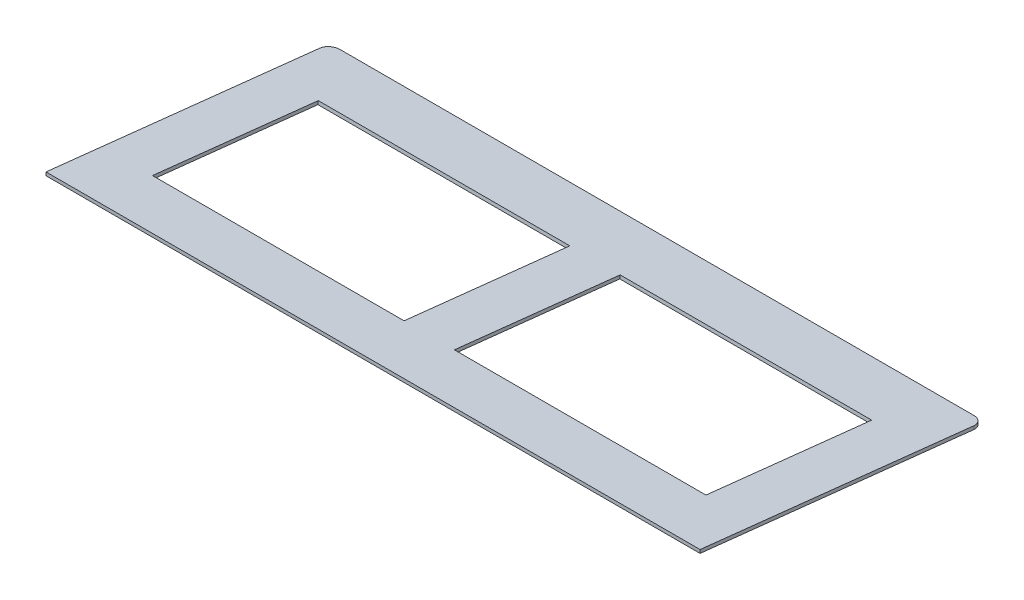
ISO-10303-21;
HEADER;
FILE_DESCRIPTION(('STEP AP214'),'2;1');
FILE_NAME('part.step','',(''),(''),'','','');
FILE_SCHEMA(('AUTOMOTIVE_DESIGN { 1 0 10303 214 1 1 1 1 }'));
ENDSEC;
DATA;
#1=APPLICATION_CONTEXT('core data for automotive mechanical design processes');
#2=APPLICATION_PROTOCOL_DEFINITION('international standard','automotive_design',2000,#1);
#3=PRODUCT_CONTEXT('',#1,'mechanical');
#4=PRODUCT('Part','Part','',(#3));
#5=PRODUCT_RELATED_PRODUCT_CATEGORY('part','',(#4));
#6=PRODUCT_DEFINITION_FORMATION('','',#4);
#7=PRODUCT_DEFINITION_CONTEXT('part definition',#1,'design');
#8=PRODUCT_DEFINITION('design','',#6,#7);
#9=PRODUCT_DEFINITION_SHAPE('','',#8);
#10=(LENGTH_UNIT() NAMED_UNIT(*) SI_UNIT(.MILLI.,.METRE.));
#11=(NAMED_UNIT(*) PLANE_ANGLE_UNIT() SI_UNIT($,.RADIAN.));
#12=(NAMED_UNIT(*) SI_UNIT($,.STERADIAN.) SOLID_ANGLE_UNIT());
#13=UNCERTAINTY_MEASURE_WITH_UNIT(LENGTH_MEASURE(1.E-05),#10,'distance_accuracy_value','');
#14=(GEOMETRIC_REPRESENTATION_CONTEXT(3) GLOBAL_UNCERTAINTY_ASSIGNED_CONTEXT((#13)) GLOBAL_UNIT_ASSIGNED_CONTEXT((#10,
#11,#12)) REPRESENTATION_CONTEXT('',''));
#15=CARTESIAN_POINT('',(0.,0.,0.));
#16=DIRECTION('',(0.,0.,1.));
#17=DIRECTION('',(1.,0.,0.));
#18=AXIS2_PLACEMENT_3D('',#15,#16,#17);
#19=CARTESIAN_POINT('',(530.482819889013,98.5307773034513,-137.4));
#20=DIRECTION('',(0.,0.,1.));
#21=DIRECTION('',(1.,0.,0.));
#22=AXIS2_PLACEMENT_3D('',#19,#20,#21);
#23=PLANE('',#22);
#24=DIRECTION('',(0.,-1.,0.));
#25=VECTOR('',#24,1.);
#26=CARTESIAN_POINT('',(354.,109.378207731382,-137.4));
#27=LINE('',#26,#25);
#28=CARTESIAN_POINT('',(354.,100.542515790759,-137.4));
#29=VERTEX_POINT('',#28);
#30=CARTESIAN_POINT('',(354.,98.5307773034513,-137.4));
#31=VERTEX_POINT('',#30);
#32=EDGE_CURVE('E231',#29,#31,#27,.T.);
#33=ORIENTED_EDGE('',*,*,#32,.T.);
#34=DIRECTION('',(-1.,0.,0.));
#35=VECTOR('',#34,1.);
#36=CARTESIAN_POINT('',(530.482819889013,98.5307773034513,-137.4));
#37=LINE('',#36,#35);
#38=CARTESIAN_POINT('',(-24.,98.5307773034513,-137.4));
#39=VERTEX_POINT('',#38);
#40=EDGE_CURVE('E270',#31,#39,#37,.T.);
#41=ORIENTED_EDGE('',*,*,#40,.T.);
#42=DIRECTION('',(0.,-1.,0.));
#43=VECTOR('',#42,1.);
#44=CARTESIAN_POINT('',(-24.,109.378207731382,-137.4));
#45=LINE('',#44,#43);
#46=CARTESIAN_POINT('',(-24.,100.542515790759,-137.4));
#47=VERTEX_POINT('',#46);
#48=EDGE_CURVE('E239',#47,#39,#45,.T.);
#49=ORIENTED_EDGE('',*,*,#48,.F.);
#50=DIRECTION('',(-1.,0.,0.));
#51=VECTOR('',#50,1.);
#52=CARTESIAN_POINT('',(530.482819889013,100.542515790759,-137.4));
#53=LINE('',#52,#51);
#54=EDGE_CURVE('E274',#29,#47,#53,.T.);
#55=ORIENTED_EDGE('',*,*,#54,.F.);
#56=EDGE_LOOP('',(#33,#41,#49,#55));
#57=FACE_BOUND('',#56,.T.);
#58=ADVANCED_FACE('F39',(#57),#23,.F.);
#59=CARTESIAN_POINT('',(360.,-349.404691512674,22.4));
#60=DIRECTION('',(1.,0.,0.));
#61=DIRECTION('',(0.,0.,-1.));
#62=AXIS2_PLACEMENT_3D('',#59,#60,#61);
#63=PLANE('',#62);
#64=DIRECTION('',(0.,-0.107870042588919,-0.994165003363056));
#65=VECTOR('',#64,1.);
#66=CARTESIAN_POINT('',(360.,113.764620707969,3.));
#67=LINE('',#66,#65);
#68=CARTESIAN_POINT('',(360.,116.896092356178,31.8606497870554));
#69=VERTEX_POINT('',#68);
#70=CARTESIAN_POINT('',(360.,99.1817962523623,-131.4));
#71=VERTEX_POINT('',#70);
#72=EDGE_CURVE('E49',#69,#71,#67,.T.);
#73=ORIENTED_EDGE('',*,*,#72,.T.);
#74=DIRECTION('',(0.,-1.,0.));
#75=VECTOR('',#74,1.);
#76=CARTESIAN_POINT('',(360.,109.378207731382,-131.4));
#77=LINE('',#76,#75);
#78=CARTESIAN_POINT('',(360.,101.19353473967,-131.4));
#79=VERTEX_POINT('',#78);
#80=EDGE_CURVE('E228',#79,#71,#77,.T.);
#81=ORIENTED_EDGE('',*,*,#80,.F.);
#82=DIRECTION('',(0.,0.107870042588919,0.994165003363056));
#83=VECTOR('',#82,1.);
#84=CARTESIAN_POINT('',(360.,100.542515790759,-137.4));
#85=LINE('',#84,#83);
#86=CARTESIAN_POINT('',(360.,118.907830843486,31.8606497870554));
#87=VERTEX_POINT('',#86);
#88=EDGE_CURVE('E11',#79,#87,#85,.T.);
#89=ORIENTED_EDGE('',*,*,#88,.T.);
#90=DIRECTION('',(0.,-1.,0.));
#91=VECTOR('',#90,1.);
#92=CARTESIAN_POINT('',(360.,118.907830843486,31.8606497870554));
#93=LINE('',#92,#91);
#94=EDGE_CURVE('E265',#87,#69,#93,.T.);
#95=ORIENTED_EDGE('',*,*,#94,.T.);
#96=EDGE_LOOP('',(#73,#81,#89,#95));
#97=FACE_BOUND('',#96,.T.);
#98=ADVANCED_FACE('F41',(#97),#63,.T.);
#99=CARTESIAN_POINT('',(530.482819889013,113.764620707969,3.));
#100=DIRECTION('',(0.,0.994165003363056,-0.107870042588919));
#101=DIRECTION('',(0.,0.107870042588919,0.994165003363056));
#102=AXIS2_PLACEMENT_3D('',#99,#100,#101);
#103=PLANE('',#102);
#104=DIRECTION('',(-1.,0.,0.));
#105=VECTOR('',#104,1.);
#106=CARTESIAN_POINT('',(150.,113.282734459728,-1.44121863777262));
#107=LINE('',#106,#105);
#108=CARTESIAN_POINT('',(150.,113.282734459728,-1.44121863777262));
#109=VERTEX_POINT('',#108);
#110=CARTESIAN_POINT('',(0.,113.282734459728,-1.4412186377726));
#111=VERTEX_POINT('',#110);
#112=EDGE_CURVE('E313',#109,#111,#107,.T.);
#113=ORIENTED_EDGE('',*,*,#112,.F.);
#114=DIRECTION('',(0.,0.107870042588919,0.994165003363056));
#115=VECTOR('',#114,1.);
#116=CARTESIAN_POINT('',(150.,102.558672334409,-100.277624028959));
#117=LINE('',#116,#115);
#118=CARTESIAN_POINT('',(150.,102.558672334409,-100.277624028959));
#119=VERTEX_POINT('',#118);
#120=EDGE_CURVE('E185',#119,#109,#117,.T.);
#121=ORIENTED_EDGE('',*,*,#120,.F.);
#122=DIRECTION('',(1.,0.,0.));
#123=VECTOR('',#122,1.);
#124=CARTESIAN_POINT('',(150.,102.558672334409,-100.277624028959));
#125=LINE('',#124,#123);
#126=CARTESIAN_POINT('',(0.,102.558672334409,-100.277624028959));
#127=VERTEX_POINT('',#126);
#128=EDGE_CURVE('E181',#127,#119,#125,.T.);
#129=ORIENTED_EDGE('',*,*,#128,.F.);
#130=DIRECTION('',(0.,-0.107870042588919,-0.994165003363056));
#131=VECTOR('',#130,1.);
#132=CARTESIAN_POINT('',(0.,102.558672334409,-100.277624028959));
#133=LINE('',#132,#131);
#134=EDGE_CURVE('E147',#111,#127,#133,.T.);
#135=ORIENTED_EDGE('',*,*,#134,.F.);
#136=EDGE_LOOP('',(#113,#121,#129,#135));
#137=FACE_BOUND('',#136,.T.);
#138=DIRECTION('',(0.,0.107870042588919,0.994165003363056));
#139=VECTOR('',#138,1.);
#140=CARTESIAN_POINT('',(330.,102.558672334409,-100.277624028959));
#141=LINE('',#140,#139);
#142=CARTESIAN_POINT('',(330.,102.558672334409,-100.277624028959));
#143=VERTEX_POINT('',#142);
#144=CARTESIAN_POINT('',(330.,113.282734459728,-1.44121863777262));
#145=VERTEX_POINT('',#144);
#146=EDGE_CURVE('E219',#143,#145,#141,.T.);
#147=ORIENTED_EDGE('',*,*,#146,.F.);
#148=DIRECTION('',(1.,0.,0.));
#149=VECTOR('',#148,1.);
#150=CARTESIAN_POINT('',(180.,102.558672334409,-100.277624028959));
#151=LINE('',#150,#149);
#152=CARTESIAN_POINT('',(180.,102.558672334409,-100.277624028959));
#153=VERTEX_POINT('',#152);
#154=EDGE_CURVE('E189',#153,#143,#151,.T.);
#155=ORIENTED_EDGE('',*,*,#154,.F.);
#156=DIRECTION('',(0.,-0.107870042588919,-0.994165003363056));
#157=VECTOR('',#156,1.);
#158=CARTESIAN_POINT('',(180.,102.558672334409,-100.277624028959));
#159=LINE('',#158,#157);
#160=CARTESIAN_POINT('',(180.,113.282734459728,-1.4412186377726));
#161=VERTEX_POINT('',#160);
#162=EDGE_CURVE('E186',#161,#153,#159,.T.);
#163=ORIENTED_EDGE('',*,*,#162,.F.);
#164=DIRECTION('',(-1.,0.,0.));
#165=VECTOR('',#164,1.);
#166=CARTESIAN_POINT('',(180.,113.282734459728,-1.44121863777262));
#167=LINE('',#166,#165);
#168=EDGE_CURVE('E203',#145,#161,#167,.T.);
#169=ORIENTED_EDGE('',*,*,#168,.F.);
#170=EDGE_LOOP('',(#147,#155,#163,#169));
#171=FACE_BOUND('',#170,.T.);
#172=ORIENTED_EDGE('',*,*,#40,.F.);
#173=CARTESIAN_POINT('',(354.,99.1817962523623,-131.4));
#174=DIRECTION('',(0.,0.994165003363056,-0.107870042588919));
#175=DIRECTION('',(0.,-0.107870042588919,-0.994165003363056));
#176=AXIS2_PLACEMENT_3D('',#173,#174,#175);
#177=ELLIPSE('',#176,6.03521546192356,6.00000000000001);
#178=EDGE_CURVE('E247',#31,#71,#177,.F.);
#179=ORIENTED_EDGE('',*,*,#178,.T.);
#180=ORIENTED_EDGE('',*,*,#72,.F.);
#181=DIRECTION('',(-1.,0.,0.));
#182=VECTOR('',#181,1.);
#183=CARTESIAN_POINT('',(530.482819889013,116.896092356178,31.8606497870554));
#184=LINE('',#183,#182);
#185=CARTESIAN_POINT('',(-30.,116.896092356178,31.8606497870554));
#186=VERTEX_POINT('',#185);
#187=EDGE_CURVE('E43',#69,#186,#184,.T.);
#188=ORIENTED_EDGE('',*,*,#187,.T.);
#189=DIRECTION('',(0.,-0.107870042588919,-0.994165003363056));
#190=VECTOR('',#189,1.);
#191=CARTESIAN_POINT('',(-30.,113.764620707969,3.));
#192=LINE('',#191,#190);
#193=CARTESIAN_POINT('',(-30.,99.1817962523623,-131.4));
#194=VERTEX_POINT('',#193);
#195=EDGE_CURVE('E251',#186,#194,#192,.T.);
#196=ORIENTED_EDGE('',*,*,#195,.T.);
#197=CARTESIAN_POINT('',(-24.,99.1817962523623,-131.4));
#198=DIRECTION('',(0.,0.994165003363056,-0.107870042588919));
#199=DIRECTION('',(0.,-0.107870042588919,-0.994165003363056));
#200=AXIS2_PLACEMENT_3D('',#197,#198,#199);
#201=ELLIPSE('',#200,6.03521546192356,6.);
#202=EDGE_CURVE('E227',#194,#39,#201,.F.);
#203=ORIENTED_EDGE('',*,*,#202,.T.);
#204=EDGE_LOOP('',(#172,#179,#180,#188,#196,#203));
#205=FACE_BOUND('',#204,.T.);
#206=ADVANCED_FACE('F293',(#137,#171,#205),#103,.F.);
#207=CARTESIAN_POINT('',(530.482819889013,100.542515790759,-137.4));
#208=DIRECTION('',(0.,-0.994165003363056,0.107870042588919));
#209=DIRECTION('',(0.,-0.107870042588919,-0.994165003363056));
#210=AXIS2_PLACEMENT_3D('',#207,#208,#209);
#211=PLANE('',#210);
#212=DIRECTION('',(-1.,0.,0.));
#213=VECTOR('',#212,1.);
#214=CARTESIAN_POINT('',(150.,104.547002341135,-100.493364114137));
#215=LINE('',#214,#213);
#216=CARTESIAN_POINT('',(150.,104.547002341135,-100.493364114137));
#217=VERTEX_POINT('',#216);
#218=CARTESIAN_POINT('',(0.,104.547002341135,-100.493364114137));
#219=VERTEX_POINT('',#218);
#220=EDGE_CURVE('E155',#217,#219,#215,.T.);
#221=ORIENTED_EDGE('',*,*,#220,.F.);
#222=DIRECTION('',(0.,-0.107870042588919,-0.994165003363056));
#223=VECTOR('',#222,1.);
#224=CARTESIAN_POINT('',(150.,104.547002341135,-100.493364114137));
#225=LINE('',#224,#223);
#226=CARTESIAN_POINT('',(150.,115.271064466454,-1.65695872295047));
#227=VERTEX_POINT('',#226);
#228=EDGE_CURVE('E161',#227,#217,#225,.T.);
#229=ORIENTED_EDGE('',*,*,#228,.F.);
#230=DIRECTION('',(1.,0.,0.));
#231=VECTOR('',#230,1.);
#232=CARTESIAN_POINT('',(150.,115.271064466454,-1.65695872295047));
#233=LINE('',#232,#231);
#234=CARTESIAN_POINT('',(0.,115.271064466454,-1.65695872295047));
#235=VERTEX_POINT('',#234);
#236=EDGE_CURVE('E166',#235,#227,#233,.T.);
#237=ORIENTED_EDGE('',*,*,#236,.F.);
#238=DIRECTION('',(0.,0.107870042588919,0.994165003363056));
#239=VECTOR('',#238,1.);
#240=CARTESIAN_POINT('',(0.,104.547002341135,-100.493364114137));
#241=LINE('',#240,#239);
#242=EDGE_CURVE('E144',#219,#235,#241,.T.);
#243=ORIENTED_EDGE('',*,*,#242,.F.);
#244=EDGE_LOOP('',(#221,#229,#237,#243));
#245=FACE_BOUND('',#244,.T.);
#246=DIRECTION('',(0.,0.107870042588919,0.994165003363056));
#247=VECTOR('',#246,1.);
#248=CARTESIAN_POINT('',(180.,104.547002341135,-100.493364114137));
#249=LINE('',#248,#247);
#250=CARTESIAN_POINT('',(180.,104.547002341135,-100.493364114137));
#251=VERTEX_POINT('',#250);
#252=CARTESIAN_POINT('',(180.,115.271064466454,-1.65695872295047));
#253=VERTEX_POINT('',#252);
#254=EDGE_CURVE('E211',#251,#253,#249,.T.);
#255=ORIENTED_EDGE('',*,*,#254,.F.);
#256=DIRECTION('',(-1.,0.,0.));
#257=VECTOR('',#256,1.);
#258=CARTESIAN_POINT('',(180.,104.547002341135,-100.493364114137));
#259=LINE('',#258,#257);
#260=CARTESIAN_POINT('',(330.,104.547002341135,-100.493364114137));
#261=VERTEX_POINT('',#260);
#262=EDGE_CURVE('E214',#261,#251,#259,.T.);
#263=ORIENTED_EDGE('',*,*,#262,.F.);
#264=DIRECTION('',(0.,-0.107870042588919,-0.994165003363056));
#265=VECTOR('',#264,1.);
#266=CARTESIAN_POINT('',(330.,104.547002341135,-100.493364114137));
#267=LINE('',#266,#265);
#268=CARTESIAN_POINT('',(330.,115.271064466454,-1.65695872295047));
#269=VERTEX_POINT('',#268);
#270=EDGE_CURVE('E194',#269,#261,#267,.T.);
#271=ORIENTED_EDGE('',*,*,#270,.F.);
#272=DIRECTION('',(1.,0.,0.));
#273=VECTOR('',#272,1.);
#274=CARTESIAN_POINT('',(180.,115.271064466454,-1.65695872295047));
#275=LINE('',#274,#273);
#276=EDGE_CURVE('E207',#253,#269,#275,.T.);
#277=ORIENTED_EDGE('',*,*,#276,.F.);
#278=EDGE_LOOP('',(#255,#263,#271,#277));
#279=FACE_BOUND('',#278,.T.);
#280=ORIENTED_EDGE('',*,*,#88,.F.);
#281=CARTESIAN_POINT('',(354.,101.19353473967,-131.4));
#282=DIRECTION('',(0.,-0.994165003363056,0.107870042588919));
#283=DIRECTION('',(0.,-0.107870042588919,-0.994165003363056));
#284=AXIS2_PLACEMENT_3D('',#281,#282,#283);
#285=ELLIPSE('',#284,6.03521546192356,6.00000000000001);
#286=EDGE_CURVE('E224',#29,#79,#285,.T.);
#287=ORIENTED_EDGE('',*,*,#286,.F.);
#288=ORIENTED_EDGE('',*,*,#54,.T.);
#289=CARTESIAN_POINT('',(-24.,101.19353473967,-131.4));
#290=DIRECTION('',(0.,-0.994165003363056,0.107870042588919));
#291=DIRECTION('',(0.,-0.107870042588919,-0.994165003363056));
#292=AXIS2_PLACEMENT_3D('',#289,#290,#291);
#293=ELLIPSE('',#292,6.03521546192356,6.);
#294=CARTESIAN_POINT('',(-30.,101.19353473967,-131.4));
#295=VERTEX_POINT('',#294);
#296=EDGE_CURVE('E184',#295,#47,#293,.T.);
#297=ORIENTED_EDGE('',*,*,#296,.F.);
#298=DIRECTION('',(0.,0.107870042588919,0.994165003363056));
#299=VECTOR('',#298,1.);
#300=CARTESIAN_POINT('',(-30.,100.542515790759,-137.4));
#301=LINE('',#300,#299);
#302=CARTESIAN_POINT('',(-30.,118.907830843486,31.8606497870554));
#303=VERTEX_POINT('',#302);
#304=EDGE_CURVE('E255',#295,#303,#301,.T.);
#305=ORIENTED_EDGE('',*,*,#304,.T.);
#306=DIRECTION('',(-1.,0.,0.));
#307=VECTOR('',#306,1.);
#308=CARTESIAN_POINT('',(530.482819889013,118.907830843486,31.8606497870554));
#309=LINE('',#308,#307);
#310=EDGE_CURVE('E269',#87,#303,#309,.T.);
#311=ORIENTED_EDGE('',*,*,#310,.F.);
#312=EDGE_LOOP('',(#280,#287,#288,#297,#305,#311));
#313=FACE_BOUND('',#312,.T.);
#314=ADVANCED_FACE('F163',(#245,#279,#313),#211,.F.);
#315=CARTESIAN_POINT('',(530.482819889013,118.907830843486,31.8606497870554));
#316=DIRECTION('',(0.,0.,-1.));
#317=DIRECTION('',(-1.,0.,0.));
#318=AXIS2_PLACEMENT_3D('',#315,#316,#317);
#319=PLANE('',#318);
#320=ORIENTED_EDGE('',*,*,#94,.F.);
#321=ORIENTED_EDGE('',*,*,#310,.T.);
#322=DIRECTION('',(0.,-1.,0.));
#323=VECTOR('',#322,1.);
#324=CARTESIAN_POINT('',(-30.,118.907830843486,31.8606497870554));
#325=LINE('',#324,#323);
#326=EDGE_CURVE('E256',#303,#186,#325,.T.);
#327=ORIENTED_EDGE('',*,*,#326,.T.);
#328=ORIENTED_EDGE('',*,*,#187,.F.);
#329=EDGE_LOOP('',(#320,#321,#327,#328));
#330=FACE_BOUND('',#329,.T.);
#331=ADVANCED_FACE('F284',(#330),#319,.F.);
#332=CARTESIAN_POINT('',(-30.,85.,-158.613203435596));
#333=DIRECTION('',(-1.,0.,0.));
#334=DIRECTION('',(0.,0.,1.));
#335=AXIS2_PLACEMENT_3D('',#332,#333,#334);
#336=PLANE('',#335);
#337=DIRECTION('',(0.,-1.,0.));
#338=VECTOR('',#337,1.);
#339=CARTESIAN_POINT('',(-30.,109.378207731382,-131.4));
#340=LINE('',#339,#338);
#341=EDGE_CURVE('E235',#295,#194,#340,.T.);
#342=ORIENTED_EDGE('',*,*,#341,.T.);
#343=ORIENTED_EDGE('',*,*,#195,.F.);
#344=ORIENTED_EDGE('',*,*,#326,.F.);
#345=ORIENTED_EDGE('',*,*,#304,.F.);
#346=EDGE_LOOP('',(#342,#343,#344,#345));
#347=FACE_BOUND('',#346,.T.);
#348=ADVANCED_FACE('F290',(#347),#336,.T.);
#349=CARTESIAN_POINT('',(-24.,109.378207731382,-131.4));
#350=DIRECTION('',(0.,-1.,0.));
#351=DIRECTION('',(0.,0.,-1.));
#352=AXIS2_PLACEMENT_3D('',#349,#350,#351);
#353=CYLINDRICAL_SURFACE('',#352,6.);
#354=ORIENTED_EDGE('',*,*,#341,.F.);
#355=ORIENTED_EDGE('',*,*,#296,.T.);
#356=ORIENTED_EDGE('',*,*,#48,.T.);
#357=ORIENTED_EDGE('',*,*,#202,.F.);
#358=EDGE_LOOP('',(#354,#355,#356,#357));
#359=FACE_BOUND('',#358,.T.);
#360=ADVANCED_FACE('F378',(#359),#353,.T.);
#361=CARTESIAN_POINT('',(354.,109.378207731382,-131.4));
#362=DIRECTION('',(0.,-1.,0.));
#363=DIRECTION('',(0.,0.,-1.));
#364=AXIS2_PLACEMENT_3D('',#361,#362,#363);
#365=CYLINDRICAL_SURFACE('',#364,6.00000000000001);
#366=ORIENTED_EDGE('',*,*,#32,.F.);
#367=ORIENTED_EDGE('',*,*,#286,.T.);
#368=ORIENTED_EDGE('',*,*,#80,.T.);
#369=ORIENTED_EDGE('',*,*,#178,.F.);
#370=EDGE_LOOP('',(#366,#367,#368,#369));
#371=FACE_BOUND('',#370,.T.);
#372=ADVANCED_FACE('F381',(#371),#365,.T.);
#373=CARTESIAN_POINT('',(180.,-76.34584477924,-80.8659189144995));
#374=DIRECTION('',(0.,-0.107870042588919,-0.994165003363056));
#375=DIRECTION('',(0.,0.994165003363056,-0.107870042588919));
#376=AXIS2_PLACEMENT_3D('',#373,#374,#375);
#377=PLANE('',#376);
#378=ORIENTED_EDGE('',*,*,#154,.T.);
#379=DIRECTION('',(0.,0.994165003363056,-0.107870042588919));
#380=VECTOR('',#379,1.);
#381=CARTESIAN_POINT('',(330.,-76.34584477924,-80.8659189144995));
#382=LINE('',#381,#380);
#383=EDGE_CURVE('E200',#143,#261,#382,.T.);
#384=ORIENTED_EDGE('',*,*,#383,.T.);
#385=ORIENTED_EDGE('',*,*,#262,.T.);
#386=DIRECTION('',(0.,0.994165003363056,-0.107870042588919));
#387=VECTOR('',#386,1.);
#388=CARTESIAN_POINT('',(180.,-76.34584477924,-80.8659189144995));
#389=LINE('',#388,#387);
#390=EDGE_CURVE('E190',#153,#251,#389,.T.);
#391=ORIENTED_EDGE('',*,*,#390,.F.);
#392=EDGE_LOOP('',(#378,#384,#385,#391));
#393=FACE_BOUND('',#392,.T.);
#394=ADVANCED_FACE('F353',(#393),#377,.F.);
#395=CARTESIAN_POINT('',(330.,-76.34584477924,-80.8659189144995));
#396=DIRECTION('',(1.,0.,0.));
#397=DIRECTION('',(0.,0.,-1.));
#398=AXIS2_PLACEMENT_3D('',#395,#396,#397);
#399=PLANE('',#398);
#400=ORIENTED_EDGE('',*,*,#146,.T.);
#401=DIRECTION('',(0.,0.994165003363056,-0.107870042588919));
#402=VECTOR('',#401,1.);
#403=CARTESIAN_POINT('',(330.,-65.6217826539214,17.970486476687));
#404=LINE('',#403,#402);
#405=EDGE_CURVE('E197',#145,#269,#404,.T.);
#406=ORIENTED_EDGE('',*,*,#405,.T.);
#407=ORIENTED_EDGE('',*,*,#270,.T.);
#408=ORIENTED_EDGE('',*,*,#383,.F.);
#409=EDGE_LOOP('',(#400,#406,#407,#408));
#410=FACE_BOUND('',#409,.T.);
#411=ADVANCED_FACE('F344',(#410),#399,.F.);
#412=CARTESIAN_POINT('',(180.,-65.6217826539214,17.970486476687));
#413=DIRECTION('',(0.,0.107870042588919,0.994165003363056));
#414=DIRECTION('',(0.,-0.994165003363056,0.107870042588919));
#415=AXIS2_PLACEMENT_3D('',#412,#413,#414);
#416=PLANE('',#415);
#417=ORIENTED_EDGE('',*,*,#168,.T.);
#418=DIRECTION('',(0.,0.994165003363056,-0.107870042588919));
#419=VECTOR('',#418,1.);
#420=CARTESIAN_POINT('',(180.,-65.6217826539214,17.970486476687));
#421=LINE('',#420,#419);
#422=EDGE_CURVE('E65',#161,#253,#421,.T.);
#423=ORIENTED_EDGE('',*,*,#422,.T.);
#424=ORIENTED_EDGE('',*,*,#276,.T.);
#425=ORIENTED_EDGE('',*,*,#405,.F.);
#426=EDGE_LOOP('',(#417,#423,#424,#425));
#427=FACE_BOUND('',#426,.T.);
#428=ADVANCED_FACE('F346',(#427),#416,.F.);
#429=CARTESIAN_POINT('',(180.,-76.34584477924,-80.8659189144995));
#430=DIRECTION('',(-1.,0.,0.));
#431=DIRECTION('',(0.,0.,1.));
#432=AXIS2_PLACEMENT_3D('',#429,#430,#431);
#433=PLANE('',#432);
#434=ORIENTED_EDGE('',*,*,#162,.T.);
#435=ORIENTED_EDGE('',*,*,#390,.T.);
#436=ORIENTED_EDGE('',*,*,#254,.T.);
#437=ORIENTED_EDGE('',*,*,#422,.F.);
#438=EDGE_LOOP('',(#434,#435,#436,#437));
#439=FACE_BOUND('',#438,.T.);
#440=ADVANCED_FACE('F354',(#439),#433,.F.);
#441=CARTESIAN_POINT('',(150.,-76.34584477924,-80.8659189144995));
#442=DIRECTION('',(1.,0.,0.));
#443=DIRECTION('',(0.,0.,-1.));
#444=AXIS2_PLACEMENT_3D('',#441,#442,#443);
#445=PLANE('',#444);
#446=ORIENTED_EDGE('',*,*,#120,.T.);
#447=DIRECTION('',(0.,0.994165003363056,-0.107870042588919));
#448=VECTOR('',#447,1.);
#449=CARTESIAN_POINT('',(150.,-65.6217826539214,17.970486476687));
#450=LINE('',#449,#448);
#451=EDGE_CURVE('E174',#109,#227,#450,.T.);
#452=ORIENTED_EDGE('',*,*,#451,.T.);
#453=ORIENTED_EDGE('',*,*,#228,.T.);
#454=DIRECTION('',(0.,0.994165003363056,-0.107870042588919));
#455=VECTOR('',#454,1.);
#456=CARTESIAN_POINT('',(150.,-76.34584477924,-80.8659189144995));
#457=LINE('',#456,#455);
#458=EDGE_CURVE('E151',#119,#217,#457,.T.);
#459=ORIENTED_EDGE('',*,*,#458,.F.);
#460=EDGE_LOOP('',(#446,#452,#453,#459));
#461=FACE_BOUND('',#460,.T.);
#462=ADVANCED_FACE('F328',(#461),#445,.F.);
#463=CARTESIAN_POINT('',(150.,-65.6217826539214,17.970486476687));
#464=DIRECTION('',(0.,0.107870042588919,0.994165003363056));
#465=DIRECTION('',(0.,-0.994165003363056,0.107870042588919));
#466=AXIS2_PLACEMENT_3D('',#463,#464,#465);
#467=PLANE('',#466);
#468=ORIENTED_EDGE('',*,*,#112,.T.);
#469=DIRECTION('',(0.,0.994165003363056,-0.107870042588919));
#470=VECTOR('',#469,1.);
#471=CARTESIAN_POINT('',(0.,-65.6217826539214,17.970486476687));
#472=LINE('',#471,#470);
#473=EDGE_CURVE('E150',#111,#235,#472,.T.);
#474=ORIENTED_EDGE('',*,*,#473,.T.);
#475=ORIENTED_EDGE('',*,*,#236,.T.);
#476=ORIENTED_EDGE('',*,*,#451,.F.);
#477=EDGE_LOOP('',(#468,#474,#475,#476));
#478=FACE_BOUND('',#477,.T.);
#479=ADVANCED_FACE('F333',(#478),#467,.F.);
#480=CARTESIAN_POINT('',(0.,-76.34584477924,-80.8659189144995));
#481=DIRECTION('',(-1.,0.,0.));
#482=DIRECTION('',(0.,0.,1.));
#483=AXIS2_PLACEMENT_3D('',#480,#481,#482);
#484=PLANE('',#483);
#485=ORIENTED_EDGE('',*,*,#134,.T.);
#486=DIRECTION('',(0.,0.994165003363056,-0.107870042588919));
#487=VECTOR('',#486,1.);
#488=CARTESIAN_POINT('',(0.,-76.34584477924,-80.8659189144995));
#489=LINE('',#488,#487);
#490=EDGE_CURVE('E57',#127,#219,#489,.T.);
#491=ORIENTED_EDGE('',*,*,#490,.T.);
#492=ORIENTED_EDGE('',*,*,#242,.T.);
#493=ORIENTED_EDGE('',*,*,#473,.F.);
#494=EDGE_LOOP('',(#485,#491,#492,#493));
#495=FACE_BOUND('',#494,.T.);
#496=ADVANCED_FACE('F141',(#495),#484,.F.);
#497=CARTESIAN_POINT('',(150.,-76.34584477924,-80.8659189144995));
#498=DIRECTION('',(0.,-0.107870042588919,-0.994165003363056));
#499=DIRECTION('',(0.,0.994165003363056,-0.107870042588919));
#500=AXIS2_PLACEMENT_3D('',#497,#498,#499);
#501=PLANE('',#500);
#502=ORIENTED_EDGE('',*,*,#128,.T.);
#503=ORIENTED_EDGE('',*,*,#458,.T.);
#504=ORIENTED_EDGE('',*,*,#220,.T.);
#505=ORIENTED_EDGE('',*,*,#490,.F.);
#506=EDGE_LOOP('',(#502,#503,#504,#505));
#507=FACE_BOUND('',#506,.T.);
#508=ADVANCED_FACE('F156',(#507),#501,.F.);
#509=CLOSED_SHELL('',(#58,#98,#206,#314,#331,#348,#360,#372,#394,#411,#428,#440,#462,#479,#496,#508));
#510=MANIFOLD_SOLID_BREP('B2',#509);
#511=ADVANCED_BREP_SHAPE_REPRESENTATION('',(#18,#510),#14);
#512=SHAPE_DEFINITION_REPRESENTATION(#9,#511);
ENDSEC;
END-ISO-10303-21;
